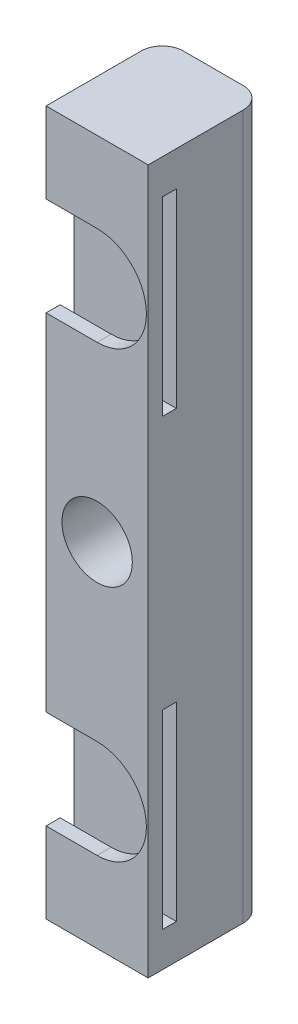
ISO-10303-21;
HEADER;
FILE_DESCRIPTION(('STEP AP214'),'2;1');
FILE_NAME('part.step','',(''),(''),'','','');
FILE_SCHEMA(('AUTOMOTIVE_DESIGN { 1 0 10303 214 1 1 1 1 }'));
ENDSEC;
DATA;
#1=APPLICATION_CONTEXT('core data for automotive mechanical design processes');
#2=APPLICATION_PROTOCOL_DEFINITION('international standard','automotive_design',2000,#1);
#3=PRODUCT_CONTEXT('',#1,'mechanical');
#4=PRODUCT('Part','Part','',(#3));
#5=PRODUCT_RELATED_PRODUCT_CATEGORY('part','',(#4));
#6=PRODUCT_DEFINITION_FORMATION('','',#4);
#7=PRODUCT_DEFINITION_CONTEXT('part definition',#1,'design');
#8=PRODUCT_DEFINITION('design','',#6,#7);
#9=PRODUCT_DEFINITION_SHAPE('','',#8);
#10=(LENGTH_UNIT() NAMED_UNIT(*) SI_UNIT(.MILLI.,.METRE.));
#11=(NAMED_UNIT(*) PLANE_ANGLE_UNIT() SI_UNIT($,.RADIAN.));
#12=(NAMED_UNIT(*) SI_UNIT($,.STERADIAN.) SOLID_ANGLE_UNIT());
#13=UNCERTAINTY_MEASURE_WITH_UNIT(LENGTH_MEASURE(1.E-05),#10,'distance_accuracy_value','');
#14=(GEOMETRIC_REPRESENTATION_CONTEXT(3) GLOBAL_UNCERTAINTY_ASSIGNED_CONTEXT((#13)) GLOBAL_UNIT_ASSIGNED_CONTEXT((#10,
#11,#12)) REPRESENTATION_CONTEXT('',''));
#15=CARTESIAN_POINT('',(0.,0.,0.));
#16=DIRECTION('',(0.,0.,1.));
#17=DIRECTION('',(1.,0.,0.));
#18=AXIS2_PLACEMENT_3D('',#15,#16,#17);
#19=CARTESIAN_POINT('',(4.25,-50.,3.));
#20=DIRECTION('',(0.,-1.,0.));
#21=DIRECTION('',(0.,0.,-1.));
#22=AXIS2_PLACEMENT_3D('',#19,#20,#21);
#23=CYLINDRICAL_SURFACE('',#22,3.);
#24=DIRECTION('',(0.,1.,0.));
#25=VECTOR('',#24,1.);
#26=CARTESIAN_POINT('',(7.25,-50.,3.));
#27=LINE('',#26,#25);
#28=CARTESIAN_POINT('',(7.25,-50.,3.));
#29=VERTEX_POINT('',#28);
#30=CARTESIAN_POINT('',(7.25,50.,3.));
#31=VERTEX_POINT('',#30);
#32=EDGE_CURVE('E344',#29,#31,#27,.T.);
#33=ORIENTED_EDGE('',*,*,#32,.F.);
#34=CARTESIAN_POINT('',(4.25,-50.,3.));
#35=DIRECTION('',(0.,1.,0.));
#36=DIRECTION('',(0.,0.,1.));
#37=AXIS2_PLACEMENT_3D('',#34,#35,#36);
#38=CIRCLE('',#37,3.);
#39=CARTESIAN_POINT('',(4.25,-50.,0.));
#40=VERTEX_POINT('',#39);
#41=EDGE_CURVE('E46',#40,#29,#38,.F.);
#42=ORIENTED_EDGE('',*,*,#41,.F.);
#43=DIRECTION('',(0.,1.,0.));
#44=VECTOR('',#43,1.);
#45=CARTESIAN_POINT('',(4.25,-50.,0.));
#46=LINE('',#45,#44);
#47=CARTESIAN_POINT('',(4.25,50.,0.));
#48=VERTEX_POINT('',#47);
#49=EDGE_CURVE('E343',#48,#40,#46,.F.);
#50=ORIENTED_EDGE('',*,*,#49,.F.);
#51=CARTESIAN_POINT('',(4.25,50.,3.));
#52=DIRECTION('',(0.,-1.,0.));
#53=DIRECTION('',(0.,0.,-1.));
#54=AXIS2_PLACEMENT_3D('',#51,#52,#53);
#55=CIRCLE('',#54,3.);
#56=EDGE_CURVE('E11',#31,#48,#55,.F.);
#57=ORIENTED_EDGE('',*,*,#56,.F.);
#58=EDGE_LOOP('',(#33,#42,#50,#57));
#59=FACE_BOUND('',#58,.T.);
#60=ADVANCED_FACE('F39',(#59),#23,.T.);
#61=CARTESIAN_POINT('',(-4.25,-50.,3.));
#62=DIRECTION('',(0.,1.,0.));
#63=DIRECTION('',(0.,0.,1.));
#64=AXIS2_PLACEMENT_3D('',#61,#62,#63);
#65=CYLINDRICAL_SURFACE('',#64,3.);
#66=DIRECTION('',(0.,-1.,0.));
#67=VECTOR('',#66,1.);
#68=CARTESIAN_POINT('',(-7.25,-50.,3.));
#69=LINE('',#68,#67);
#70=CARTESIAN_POINT('',(-7.25,50.,3.));
#71=VERTEX_POINT('',#70);
#72=CARTESIAN_POINT('',(-7.25,-50.,3.));
#73=VERTEX_POINT('',#72);
#74=EDGE_CURVE('E334',#71,#73,#69,.T.);
#75=ORIENTED_EDGE('',*,*,#74,.F.);
#76=CARTESIAN_POINT('',(-4.25,50.,3.));
#77=DIRECTION('',(0.,-1.,0.));
#78=DIRECTION('',(0.,0.,-1.));
#79=AXIS2_PLACEMENT_3D('',#76,#77,#78);
#80=CIRCLE('',#79,3.);
#81=CARTESIAN_POINT('',(-4.25,50.,0.));
#82=VERTEX_POINT('',#81);
#83=EDGE_CURVE('E336',#82,#71,#80,.F.);
#84=ORIENTED_EDGE('',*,*,#83,.F.);
#85=DIRECTION('',(0.,-1.,0.));
#86=VECTOR('',#85,1.);
#87=CARTESIAN_POINT('',(-4.25,-50.,0.));
#88=LINE('',#87,#86);
#89=CARTESIAN_POINT('',(-4.25,-50.,0.));
#90=VERTEX_POINT('',#89);
#91=EDGE_CURVE('E333',#90,#82,#88,.F.);
#92=ORIENTED_EDGE('',*,*,#91,.F.);
#93=CARTESIAN_POINT('',(-4.25,-50.,3.));
#94=DIRECTION('',(0.,1.,0.));
#95=DIRECTION('',(0.,0.,1.));
#96=AXIS2_PLACEMENT_3D('',#93,#94,#95);
#97=CIRCLE('',#96,3.);
#98=EDGE_CURVE('E338',#73,#90,#97,.F.);
#99=ORIENTED_EDGE('',*,*,#98,.F.);
#100=EDGE_LOOP('',(#75,#84,#92,#99));
#101=FACE_BOUND('',#100,.T.);
#102=ADVANCED_FACE('F370',(#101),#65,.T.);
#103=CARTESIAN_POINT('',(0.,0.,16.5));
#104=DIRECTION('',(0.,0.,-1.));
#105=DIRECTION('',(-1.,0.,0.));
#106=AXIS2_PLACEMENT_3D('',#103,#104,#105);
#107=PLANE('',#106);
#108=CARTESIAN_POINT('',(0.,0.,16.5));
#109=DIRECTION('',(0.,0.,1.));
#110=DIRECTION('',(1.,0.,0.));
#111=AXIS2_PLACEMENT_3D('',#108,#109,#110);
#112=CIRCLE('',#111,5.);
#113=CARTESIAN_POINT('',(5.,0.,16.5));
#114=VERTEX_POINT('',#113);
#115=EDGE_CURVE('E276',#114,#114,#112,.T.);
#116=ORIENTED_EDGE('',*,*,#115,.F.);
#117=EDGE_LOOP('',(#116));
#118=FACE_BOUND('',#117,.T.);
#119=DIRECTION('',(0.,-1.,0.));
#120=VECTOR('',#119,1.);
#121=CARTESIAN_POINT('',(-7.25,-50.,16.5));
#122=LINE('',#121,#120);
#123=CARTESIAN_POINT('',(-7.25,50.,16.5));
#124=VERTEX_POINT('',#123);
#125=CARTESIAN_POINT('',(-7.25,38.55,16.5));
#126=VERTEX_POINT('',#125);
#127=EDGE_CURVE('E293',#124,#126,#122,.T.);
#128=ORIENTED_EDGE('',*,*,#127,.T.);
#129=DIRECTION('',(1.,0.,0.));
#130=VECTOR('',#129,1.);
#131=CARTESIAN_POINT('',(0.,38.55,16.5));
#132=LINE('',#131,#130);
#133=CARTESIAN_POINT('',(0.,38.55,16.5));
#134=VERTEX_POINT('',#133);
#135=EDGE_CURVE('E188',#126,#134,#132,.T.);
#136=ORIENTED_EDGE('',*,*,#135,.T.);
#137=CARTESIAN_POINT('',(0.,31.55,16.5));
#138=DIRECTION('',(0.,0.,-1.));
#139=DIRECTION('',(1.,0.,0.));
#140=AXIS2_PLACEMENT_3D('',#137,#138,#139);
#141=CIRCLE('',#140,7.);
#142=CARTESIAN_POINT('',(0.,24.55,16.5));
#143=VERTEX_POINT('',#142);
#144=EDGE_CURVE('E590',#134,#143,#141,.T.);
#145=ORIENTED_EDGE('',*,*,#144,.T.);
#146=DIRECTION('',(-1.,0.,0.));
#147=VECTOR('',#146,1.);
#148=CARTESIAN_POINT('',(0.,24.55,16.5));
#149=LINE('',#148,#147);
#150=CARTESIAN_POINT('',(-7.25,24.55,16.5));
#151=VERTEX_POINT('',#150);
#152=EDGE_CURVE('E584',#143,#151,#149,.T.);
#153=ORIENTED_EDGE('',*,*,#152,.T.);
#154=CARTESIAN_POINT('',(-7.25,-24.55,16.5));
#155=VERTEX_POINT('',#154);
#156=EDGE_CURVE('E295',#151,#155,#122,.T.);
#157=ORIENTED_EDGE('',*,*,#156,.T.);
#158=DIRECTION('',(-1.,0.,0.));
#159=VECTOR('',#158,1.);
#160=CARTESIAN_POINT('',(0.,-24.55,16.5));
#161=LINE('',#160,#159);
#162=CARTESIAN_POINT('',(0.,-24.55,16.5));
#163=VERTEX_POINT('',#162);
#164=EDGE_CURVE('E241',#163,#155,#161,.T.);
#165=ORIENTED_EDGE('',*,*,#164,.F.);
#166=CARTESIAN_POINT('',(0.,-31.55,16.5));
#167=DIRECTION('',(0.,0.,1.));
#168=DIRECTION('',(1.,0.,0.));
#169=AXIS2_PLACEMENT_3D('',#166,#167,#168);
#170=CIRCLE('',#169,7.);
#171=CARTESIAN_POINT('',(0.,-38.55,16.5));
#172=VERTEX_POINT('',#171);
#173=EDGE_CURVE('E227',#172,#163,#170,.T.);
#174=ORIENTED_EDGE('',*,*,#173,.F.);
#175=DIRECTION('',(1.,0.,0.));
#176=VECTOR('',#175,1.);
#177=CARTESIAN_POINT('',(0.,-38.55,16.5));
#178=LINE('',#177,#176);
#179=CARTESIAN_POINT('',(-7.25,-38.55,16.5));
#180=VERTEX_POINT('',#179);
#181=EDGE_CURVE('E235',#180,#172,#178,.T.);
#182=ORIENTED_EDGE('',*,*,#181,.F.);
#183=CARTESIAN_POINT('',(-7.25,-50.,16.5));
#184=VERTEX_POINT('',#183);
#185=EDGE_CURVE('E286',#180,#184,#122,.T.);
#186=ORIENTED_EDGE('',*,*,#185,.T.);
#187=DIRECTION('',(1.,0.,0.));
#188=VECTOR('',#187,1.);
#189=CARTESIAN_POINT('',(7.25,-50.,16.5));
#190=LINE('',#189,#188);
#191=CARTESIAN_POINT('',(7.25,-50.,16.5));
#192=VERTEX_POINT('',#191);
#193=EDGE_CURVE('E291',#184,#192,#190,.T.);
#194=ORIENTED_EDGE('',*,*,#193,.T.);
#195=DIRECTION('',(0.,1.,0.));
#196=VECTOR('',#195,1.);
#197=CARTESIAN_POINT('',(7.25,-50.,16.5));
#198=LINE('',#197,#196);
#199=CARTESIAN_POINT('',(7.25,50.,16.5));
#200=VERTEX_POINT('',#199);
#201=EDGE_CURVE('E298',#192,#200,#198,.T.);
#202=ORIENTED_EDGE('',*,*,#201,.T.);
#203=DIRECTION('',(-1.,0.,0.));
#204=VECTOR('',#203,1.);
#205=CARTESIAN_POINT('',(7.25,50.,16.5));
#206=LINE('',#205,#204);
#207=EDGE_CURVE('E287',#200,#124,#206,.T.);
#208=ORIENTED_EDGE('',*,*,#207,.T.);
#209=EDGE_LOOP('',(#128,#136,#145,#153,#157,#165,#174,#182,#186,#194,#202,#208));
#210=FACE_BOUND('',#209,.T.);
#211=ADVANCED_FACE('F357',(#118,#210),#107,.F.);
#212=CARTESIAN_POINT('',(0.,0.,14.5));
#213=DIRECTION('',(0.,0.,-1.));
#214=DIRECTION('',(-1.,0.,0.));
#215=AXIS2_PLACEMENT_3D('',#212,#213,#214);
#216=PLANE('',#215);
#217=DIRECTION('',(-1.,0.,0.));
#218=VECTOR('',#217,1.);
#219=CARTESIAN_POINT('',(0.,24.55,14.5));
#220=LINE('',#219,#218);
#221=CARTESIAN_POINT('',(0.,24.55,14.5));
#222=VERTEX_POINT('',#221);
#223=CARTESIAN_POINT('',(-7.25,24.55,14.5));
#224=VERTEX_POINT('',#223);
#225=EDGE_CURVE('E205',#222,#224,#220,.T.);
#226=ORIENTED_EDGE('',*,*,#225,.F.);
#227=CARTESIAN_POINT('',(0.,31.55,14.5));
#228=DIRECTION('',(0.,0.,-1.));
#229=DIRECTION('',(1.,0.,0.));
#230=AXIS2_PLACEMENT_3D('',#227,#228,#229);
#231=CIRCLE('',#230,7.);
#232=CARTESIAN_POINT('',(0.,38.55,14.5));
#233=VERTEX_POINT('',#232);
#234=EDGE_CURVE('E204',#233,#222,#231,.T.);
#235=ORIENTED_EDGE('',*,*,#234,.F.);
#236=DIRECTION('',(1.,0.,0.));
#237=VECTOR('',#236,1.);
#238=CARTESIAN_POINT('',(0.,38.55,14.5));
#239=LINE('',#238,#237);
#240=CARTESIAN_POINT('',(-7.25,38.55,14.5));
#241=VERTEX_POINT('',#240);
#242=EDGE_CURVE('E190',#241,#233,#239,.T.);
#243=ORIENTED_EDGE('',*,*,#242,.F.);
#244=DIRECTION('',(0.,1.,0.));
#245=VECTOR('',#244,1.);
#246=CARTESIAN_POINT('',(-7.25,-50.,14.5));
#247=LINE('',#246,#245);
#248=CARTESIAN_POINT('',(-7.25,45.05,14.5));
#249=VERTEX_POINT('',#248);
#250=EDGE_CURVE('E200',#241,#249,#247,.T.);
#251=ORIENTED_EDGE('',*,*,#250,.T.);
#252=DIRECTION('',(1.,0.,0.));
#253=VECTOR('',#252,1.);
#254=CARTESIAN_POINT('',(-13.5,45.05,14.5));
#255=LINE('',#254,#253);
#256=CARTESIAN_POINT('',(7.25,45.05,14.5));
#257=VERTEX_POINT('',#256);
#258=EDGE_CURVE('E592',#249,#257,#255,.T.);
#259=ORIENTED_EDGE('',*,*,#258,.T.);
#260=DIRECTION('',(0.,-1.,0.));
#261=VECTOR('',#260,1.);
#262=CARTESIAN_POINT('',(7.25,-50.,14.5));
#263=LINE('',#262,#261);
#264=CARTESIAN_POINT('',(7.25,18.05,14.5));
#265=VERTEX_POINT('',#264);
#266=EDGE_CURVE('E324',#257,#265,#263,.T.);
#267=ORIENTED_EDGE('',*,*,#266,.T.);
#268=DIRECTION('',(-1.,0.,0.));
#269=VECTOR('',#268,1.);
#270=CARTESIAN_POINT('',(-13.5,18.05,14.5));
#271=LINE('',#270,#269);
#272=CARTESIAN_POINT('',(-7.25,18.05,14.5));
#273=VERTEX_POINT('',#272);
#274=EDGE_CURVE('E220',#265,#273,#271,.T.);
#275=ORIENTED_EDGE('',*,*,#274,.T.);
#276=EDGE_CURVE('E208',#273,#224,#247,.T.);
#277=ORIENTED_EDGE('',*,*,#276,.T.);
#278=EDGE_LOOP('',(#226,#235,#243,#251,#259,#267,#275,#277));
#279=FACE_BOUND('',#278,.T.);
#280=ADVANCED_FACE('F198',(#279),#216,.T.);
#281=CARTESIAN_POINT('',(0.,0.,14.5));
#282=DIRECTION('',(0.,0.,-1.));
#283=DIRECTION('',(-1.,0.,0.));
#284=AXIS2_PLACEMENT_3D('',#281,#282,#283);
#285=PLANE('',#284);
#286=DIRECTION('',(0.,1.,0.));
#287=VECTOR('',#286,1.);
#288=CARTESIAN_POINT('',(-7.25,-50.,14.5));
#289=LINE('',#288,#287);
#290=CARTESIAN_POINT('',(-7.25,-45.05,14.5));
#291=VERTEX_POINT('',#290);
#292=CARTESIAN_POINT('',(-7.25,-38.55,14.5));
#293=VERTEX_POINT('',#292);
#294=EDGE_CURVE('E269',#291,#293,#289,.T.);
#295=ORIENTED_EDGE('',*,*,#294,.T.);
#296=DIRECTION('',(1.,0.,0.));
#297=VECTOR('',#296,1.);
#298=CARTESIAN_POINT('',(0.,-38.55,14.5));
#299=LINE('',#298,#297);
#300=CARTESIAN_POINT('',(0.,-38.55,14.5));
#301=VERTEX_POINT('',#300);
#302=EDGE_CURVE('E232',#293,#301,#299,.T.);
#303=ORIENTED_EDGE('',*,*,#302,.T.);
#304=CARTESIAN_POINT('',(0.,-31.55,14.5));
#305=DIRECTION('',(0.,0.,1.));
#306=DIRECTION('',(1.,0.,0.));
#307=AXIS2_PLACEMENT_3D('',#304,#305,#306);
#308=CIRCLE('',#307,7.);
#309=CARTESIAN_POINT('',(0.,-24.55,14.5));
#310=VERTEX_POINT('',#309);
#311=EDGE_CURVE('E226',#301,#310,#308,.T.);
#312=ORIENTED_EDGE('',*,*,#311,.T.);
#313=DIRECTION('',(-1.,0.,0.));
#314=VECTOR('',#313,1.);
#315=CARTESIAN_POINT('',(0.,-24.55,14.5));
#316=LINE('',#315,#314);
#317=CARTESIAN_POINT('',(-7.25,-24.55,14.5));
#318=VERTEX_POINT('',#317);
#319=EDGE_CURVE('E233',#310,#318,#316,.T.);
#320=ORIENTED_EDGE('',*,*,#319,.T.);
#321=CARTESIAN_POINT('',(-7.25,-18.05,14.5));
#322=VERTEX_POINT('',#321);
#323=EDGE_CURVE('E262',#318,#322,#289,.T.);
#324=ORIENTED_EDGE('',*,*,#323,.T.);
#325=DIRECTION('',(-1.,0.,0.));
#326=VECTOR('',#325,1.);
#327=CARTESIAN_POINT('',(-13.5,-18.05,14.5));
#328=LINE('',#327,#326);
#329=CARTESIAN_POINT('',(7.25,-18.05,14.5));
#330=VERTEX_POINT('',#329);
#331=EDGE_CURVE('E247',#330,#322,#328,.T.);
#332=ORIENTED_EDGE('',*,*,#331,.F.);
#333=DIRECTION('',(0.,-1.,0.));
#334=VECTOR('',#333,1.);
#335=CARTESIAN_POINT('',(7.25,-50.,14.5));
#336=LINE('',#335,#334);
#337=CARTESIAN_POINT('',(7.25,-45.05,14.5));
#338=VERTEX_POINT('',#337);
#339=EDGE_CURVE('E311',#330,#338,#336,.T.);
#340=ORIENTED_EDGE('',*,*,#339,.T.);
#341=DIRECTION('',(1.,0.,0.));
#342=VECTOR('',#341,1.);
#343=CARTESIAN_POINT('',(-13.5,-45.05,14.5));
#344=LINE('',#343,#342);
#345=EDGE_CURVE('E256',#291,#338,#344,.T.);
#346=ORIENTED_EDGE('',*,*,#345,.F.);
#347=EDGE_LOOP('',(#295,#303,#312,#320,#324,#332,#340,#346));
#348=FACE_BOUND('',#347,.T.);
#349=ADVANCED_FACE('F373',(#348),#285,.T.);
#350=CARTESIAN_POINT('',(7.25,50.,16.5));
#351=DIRECTION('',(0.,-1.,0.));
#352=DIRECTION('',(0.,0.,-1.));
#353=AXIS2_PLACEMENT_3D('',#350,#351,#352);
#354=PLANE('',#353);
#355=DIRECTION('',(0.,0.,-1.));
#356=VECTOR('',#355,1.);
#357=CARTESIAN_POINT('',(7.25,50.,16.5));
#358=LINE('',#357,#356);
#359=EDGE_CURVE('E296',#200,#31,#358,.T.);
#360=ORIENTED_EDGE('',*,*,#359,.T.);
#361=ORIENTED_EDGE('',*,*,#56,.T.);
#362=DIRECTION('',(-1.,0.,0.));
#363=VECTOR('',#362,1.);
#364=CARTESIAN_POINT('',(7.25,50.,0.));
#365=LINE('',#364,#363);
#366=EDGE_CURVE('E284',#48,#82,#365,.T.);
#367=ORIENTED_EDGE('',*,*,#366,.T.);
#368=ORIENTED_EDGE('',*,*,#83,.T.);
#369=DIRECTION('',(0.,0.,-1.));
#370=VECTOR('',#369,1.);
#371=CARTESIAN_POINT('',(-7.25,50.,16.5));
#372=LINE('',#371,#370);
#373=EDGE_CURVE('E307',#124,#71,#372,.T.);
#374=ORIENTED_EDGE('',*,*,#373,.F.);
#375=ORIENTED_EDGE('',*,*,#207,.F.);
#376=EDGE_LOOP('',(#360,#361,#367,#368,#374,#375));
#377=FACE_BOUND('',#376,.T.);
#378=ADVANCED_FACE('F371',(#377),#354,.F.);
#379=CARTESIAN_POINT('',(-7.25,-50.,16.5));
#380=DIRECTION('',(1.,0.,0.));
#381=DIRECTION('',(0.,0.,-1.));
#382=AXIS2_PLACEMENT_3D('',#379,#380,#381);
#383=PLANE('',#382);
#384=ORIENTED_EDGE('',*,*,#373,.T.);
#385=ORIENTED_EDGE('',*,*,#74,.T.);
#386=DIRECTION('',(0.,0.,-1.));
#387=VECTOR('',#386,1.);
#388=CARTESIAN_POINT('',(-7.25,-50.,16.5));
#389=LINE('',#388,#387);
#390=EDGE_CURVE('E306',#184,#73,#389,.T.);
#391=ORIENTED_EDGE('',*,*,#390,.F.);
#392=ORIENTED_EDGE('',*,*,#185,.F.);
#393=DIRECTION('',(0.,0.,1.));
#394=VECTOR('',#393,1.);
#395=CARTESIAN_POINT('',(-7.25,-38.55,14.5));
#396=LINE('',#395,#394);
#397=EDGE_CURVE('E248',#293,#180,#396,.T.);
#398=ORIENTED_EDGE('',*,*,#397,.F.);
#399=ORIENTED_EDGE('',*,*,#294,.F.);
#400=DIRECTION('',(0.,0.,-1.));
#401=VECTOR('',#400,1.);
#402=CARTESIAN_POINT('',(-7.25,-45.05,16.5));
#403=LINE('',#402,#401);
#404=CARTESIAN_POINT('',(-7.25,-45.05,12.5));
#405=VERTEX_POINT('',#404);
#406=EDGE_CURVE('E277',#291,#405,#403,.T.);
#407=ORIENTED_EDGE('',*,*,#406,.T.);
#408=DIRECTION('',(0.,1.,0.));
#409=VECTOR('',#408,1.);
#410=CARTESIAN_POINT('',(-7.25,-50.,12.5));
#411=LINE('',#410,#409);
#412=CARTESIAN_POINT('',(-7.25,-18.05,12.5));
#413=VERTEX_POINT('',#412);
#414=EDGE_CURVE('E268',#405,#413,#411,.T.);
#415=ORIENTED_EDGE('',*,*,#414,.T.);
#416=DIRECTION('',(0.,0.,1.));
#417=VECTOR('',#416,1.);
#418=CARTESIAN_POINT('',(-7.25,-18.05,16.5));
#419=LINE('',#418,#417);
#420=EDGE_CURVE('E271',#413,#322,#419,.T.);
#421=ORIENTED_EDGE('',*,*,#420,.T.);
#422=ORIENTED_EDGE('',*,*,#323,.F.);
#423=DIRECTION('',(0.,0.,1.));
#424=VECTOR('',#423,1.);
#425=CARTESIAN_POINT('',(-7.25,-24.55,14.5));
#426=LINE('',#425,#424);
#427=EDGE_CURVE('E252',#318,#155,#426,.T.);
#428=ORIENTED_EDGE('',*,*,#427,.T.);
#429=ORIENTED_EDGE('',*,*,#156,.F.);
#430=DIRECTION('',(0.,0.,1.));
#431=VECTOR('',#430,1.);
#432=CARTESIAN_POINT('',(-7.25,24.55,14.5));
#433=LINE('',#432,#431);
#434=EDGE_CURVE('E191',#224,#151,#433,.T.);
#435=ORIENTED_EDGE('',*,*,#434,.F.);
#436=ORIENTED_EDGE('',*,*,#276,.F.);
#437=DIRECTION('',(0.,0.,1.));
#438=VECTOR('',#437,1.);
#439=CARTESIAN_POINT('',(-7.25,18.05,16.5));
#440=LINE('',#439,#438);
#441=CARTESIAN_POINT('',(-7.25,18.05,12.5));
#442=VERTEX_POINT('',#441);
#443=EDGE_CURVE('E221',#442,#273,#440,.T.);
#444=ORIENTED_EDGE('',*,*,#443,.F.);
#445=DIRECTION('',(0.,1.,0.));
#446=VECTOR('',#445,1.);
#447=CARTESIAN_POINT('',(-7.25,-50.,12.5));
#448=LINE('',#447,#446);
#449=CARTESIAN_POINT('',(-7.25,45.05,12.5));
#450=VERTEX_POINT('',#449);
#451=EDGE_CURVE('E211',#442,#450,#448,.T.);
#452=ORIENTED_EDGE('',*,*,#451,.T.);
#453=DIRECTION('',(0.,0.,-1.));
#454=VECTOR('',#453,1.);
#455=CARTESIAN_POINT('',(-7.25,45.05,16.5));
#456=LINE('',#455,#454);
#457=EDGE_CURVE('E209',#249,#450,#456,.T.);
#458=ORIENTED_EDGE('',*,*,#457,.F.);
#459=ORIENTED_EDGE('',*,*,#250,.F.);
#460=DIRECTION('',(0.,0.,1.));
#461=VECTOR('',#460,1.);
#462=CARTESIAN_POINT('',(-7.25,38.55,14.5));
#463=LINE('',#462,#461);
#464=EDGE_CURVE('E183',#241,#126,#463,.T.);
#465=ORIENTED_EDGE('',*,*,#464,.T.);
#466=ORIENTED_EDGE('',*,*,#127,.F.);
#467=EDGE_LOOP('',(#384,#385,#391,#392,#398,#399,#407,#415,#421,#422,#428,#429,#435,#436,#444,
#452,#458,#459,#465,#466));
#468=FACE_BOUND('',#467,.T.);
#469=ADVANCED_FACE('F210',(#468),#383,.F.);
#470=CARTESIAN_POINT('',(7.25,-50.,16.5));
#471=DIRECTION('',(0.,1.,0.));
#472=DIRECTION('',(0.,0.,1.));
#473=AXIS2_PLACEMENT_3D('',#470,#471,#472);
#474=PLANE('',#473);
#475=DIRECTION('',(1.,0.,0.));
#476=VECTOR('',#475,1.);
#477=CARTESIAN_POINT('',(7.25,-50.,0.));
#478=LINE('',#477,#476);
#479=EDGE_CURVE('E288',#90,#40,#478,.T.);
#480=ORIENTED_EDGE('',*,*,#479,.T.);
#481=ORIENTED_EDGE('',*,*,#41,.T.);
#482=DIRECTION('',(0.,0.,-1.));
#483=VECTOR('',#482,1.);
#484=CARTESIAN_POINT('',(7.25,-50.,16.5));
#485=LINE('',#484,#483);
#486=EDGE_CURVE('E303',#192,#29,#485,.T.);
#487=ORIENTED_EDGE('',*,*,#486,.F.);
#488=ORIENTED_EDGE('',*,*,#193,.F.);
#489=ORIENTED_EDGE('',*,*,#390,.T.);
#490=ORIENTED_EDGE('',*,*,#98,.T.);
#491=EDGE_LOOP('',(#480,#481,#487,#488,#489,#490));
#492=FACE_BOUND('',#491,.T.);
#493=ADVANCED_FACE('F349',(#492),#474,.F.);
#494=CARTESIAN_POINT('',(7.25,-50.,16.5));
#495=DIRECTION('',(-1.,0.,0.));
#496=DIRECTION('',(0.,0.,1.));
#497=AXIS2_PLACEMENT_3D('',#494,#495,#496);
#498=PLANE('',#497);
#499=DIRECTION('',(0.,0.,1.));
#500=VECTOR('',#499,1.);
#501=CARTESIAN_POINT('',(7.25,45.05,16.5));
#502=LINE('',#501,#500);
#503=CARTESIAN_POINT('',(7.25,45.05,12.5));
#504=VERTEX_POINT('',#503);
#505=EDGE_CURVE('E321',#504,#257,#502,.T.);
#506=ORIENTED_EDGE('',*,*,#505,.F.);
#507=DIRECTION('',(0.,-1.,0.));
#508=VECTOR('',#507,1.);
#509=CARTESIAN_POINT('',(7.25,-50.,12.5));
#510=LINE('',#509,#508);
#511=CARTESIAN_POINT('',(7.25,18.05,12.5));
#512=VERTEX_POINT('',#511);
#513=EDGE_CURVE('E328',#504,#512,#510,.T.);
#514=ORIENTED_EDGE('',*,*,#513,.T.);
#515=DIRECTION('',(0.,0.,-1.));
#516=VECTOR('',#515,1.);
#517=CARTESIAN_POINT('',(7.25,18.05,16.5));
#518=LINE('',#517,#516);
#519=EDGE_CURVE('E327',#265,#512,#518,.T.);
#520=ORIENTED_EDGE('',*,*,#519,.F.);
#521=ORIENTED_EDGE('',*,*,#266,.F.);
#522=EDGE_LOOP('',(#506,#514,#520,#521));
#523=FACE_BOUND('',#522,.T.);
#524=DIRECTION('',(0.,0.,-1.));
#525=VECTOR('',#524,1.);
#526=CARTESIAN_POINT('',(7.25,-18.05,16.5));
#527=LINE('',#526,#525);
#528=CARTESIAN_POINT('',(7.25,-18.05,12.5));
#529=VERTEX_POINT('',#528);
#530=EDGE_CURVE('E312',#330,#529,#527,.T.);
#531=ORIENTED_EDGE('',*,*,#530,.T.);
#532=DIRECTION('',(0.,-1.,0.));
#533=VECTOR('',#532,1.);
#534=CARTESIAN_POINT('',(7.25,-50.,12.5));
#535=LINE('',#534,#533);
#536=CARTESIAN_POINT('',(7.25,-45.05,12.5));
#537=VERTEX_POINT('',#536);
#538=EDGE_CURVE('E316',#529,#537,#535,.T.);
#539=ORIENTED_EDGE('',*,*,#538,.T.);
#540=DIRECTION('',(0.,0.,1.));
#541=VECTOR('',#540,1.);
#542=CARTESIAN_POINT('',(7.25,-45.05,16.5));
#543=LINE('',#542,#541);
#544=EDGE_CURVE('E317',#537,#338,#543,.T.);
#545=ORIENTED_EDGE('',*,*,#544,.T.);
#546=ORIENTED_EDGE('',*,*,#339,.F.);
#547=EDGE_LOOP('',(#531,#539,#545,#546));
#548=FACE_BOUND('',#547,.T.);
#549=ORIENTED_EDGE('',*,*,#486,.T.);
#550=ORIENTED_EDGE('',*,*,#32,.T.);
#551=ORIENTED_EDGE('',*,*,#359,.F.);
#552=ORIENTED_EDGE('',*,*,#201,.F.);
#553=EDGE_LOOP('',(#549,#550,#551,#552));
#554=FACE_BOUND('',#553,.T.);
#555=ADVANCED_FACE('F351',(#523,#548,#554),#498,.F.);
#556=CARTESIAN_POINT('',(0.,0.,0.));
#557=DIRECTION('',(0.,0.,-1.));
#558=DIRECTION('',(-1.,0.,0.));
#559=AXIS2_PLACEMENT_3D('',#556,#557,#558);
#560=PLANE('',#559);
#561=ORIENTED_EDGE('',*,*,#366,.F.);
#562=ORIENTED_EDGE('',*,*,#49,.T.);
#563=ORIENTED_EDGE('',*,*,#479,.F.);
#564=ORIENTED_EDGE('',*,*,#91,.T.);
#565=EDGE_LOOP('',(#561,#562,#563,#564));
#566=FACE_BOUND('',#565,.T.);
#567=ADVANCED_FACE('F369',(#566),#560,.T.);
#568=CARTESIAN_POINT('',(0.,0.,3.5));
#569=DIRECTION('',(0.,0.,1.));
#570=DIRECTION('',(1.,0.,0.));
#571=AXIS2_PLACEMENT_3D('',#568,#569,#570);
#572=CYLINDRICAL_SURFACE('',#571,5.);
#573=CARTESIAN_POINT('',(0.,0.,3.5));
#574=DIRECTION('',(0.,0.,1.));
#575=DIRECTION('',(1.,0.,0.));
#576=AXIS2_PLACEMENT_3D('',#573,#574,#575);
#577=CIRCLE('',#576,5.);
#578=CARTESIAN_POINT('',(5.,0.,3.5));
#579=VERTEX_POINT('',#578);
#580=EDGE_CURVE('E278',#579,#579,#577,.T.);
#581=CARTESIAN_POINT('',(5.,0.,3.5));
#582=CARTESIAN_POINT('',(5.,0.,3.63541666666667));
#583=CARTESIAN_POINT('',(5.,0.,3.77083333333333));
#584=CARTESIAN_POINT('',(5.,0.,4.04166666666667));
#585=CARTESIAN_POINT('',(5.,0.,4.17708333333333));
#586=CARTESIAN_POINT('',(5.,0.,4.44791666666667));
#587=CARTESIAN_POINT('',(5.,0.,4.58333333333333));
#588=CARTESIAN_POINT('',(5.,0.,4.85416666666667));
#589=CARTESIAN_POINT('',(5.,0.,4.98958333333333));
#590=CARTESIAN_POINT('',(5.,0.,5.26041666666667));
#591=CARTESIAN_POINT('',(5.,0.,5.39583333333333));
#592=CARTESIAN_POINT('',(5.,0.,5.66666666666667));
#593=CARTESIAN_POINT('',(5.,0.,5.80208333333333));
#594=CARTESIAN_POINT('',(5.,0.,6.07291666666667));
#595=CARTESIAN_POINT('',(5.,0.,6.20833333333333));
#596=CARTESIAN_POINT('',(5.,0.,6.47916666666667));
#597=CARTESIAN_POINT('',(5.,0.,6.61458333333333));
#598=CARTESIAN_POINT('',(5.,0.,6.88541666666667));
#599=CARTESIAN_POINT('',(5.,0.,7.02083333333333));
#600=CARTESIAN_POINT('',(5.,0.,7.29166666666667));
#601=CARTESIAN_POINT('',(5.,0.,7.42708333333333));
#602=CARTESIAN_POINT('',(5.,0.,7.69791666666667));
#603=CARTESIAN_POINT('',(5.,0.,7.83333333333333));
#604=CARTESIAN_POINT('',(5.,0.,8.10416666666667));
#605=CARTESIAN_POINT('',(5.,0.,8.23958333333333));
#606=CARTESIAN_POINT('',(5.,0.,8.51041666666667));
#607=CARTESIAN_POINT('',(5.,0.,8.64583333333333));
#608=CARTESIAN_POINT('',(5.,0.,8.91666666666667));
#609=CARTESIAN_POINT('',(5.,0.,9.05208333333333));
#610=CARTESIAN_POINT('',(5.,0.,9.32291666666666));
#611=CARTESIAN_POINT('',(5.,0.,9.45833333333333));
#612=CARTESIAN_POINT('',(5.,0.,9.72916666666667));
#613=CARTESIAN_POINT('',(5.,0.,9.86458333333333));
#614=CARTESIAN_POINT('',(5.,0.,10.1354166666667));
#615=CARTESIAN_POINT('',(5.,0.,10.2708333333333));
#616=CARTESIAN_POINT('',(5.,0.,10.5416666666667));
#617=CARTESIAN_POINT('',(5.,0.,10.6770833333333));
#618=CARTESIAN_POINT('',(5.,0.,10.9479166666667));
#619=CARTESIAN_POINT('',(5.,0.,11.0833333333333));
#620=CARTESIAN_POINT('',(5.,0.,11.3541666666667));
#621=CARTESIAN_POINT('',(5.,0.,11.4895833333333));
#622=CARTESIAN_POINT('',(5.,0.,11.7604166666667));
#623=CARTESIAN_POINT('',(5.,0.,11.8958333333333));
#624=CARTESIAN_POINT('',(5.,0.,12.1666666666667));
#625=CARTESIAN_POINT('',(5.,0.,12.3020833333333));
#626=CARTESIAN_POINT('',(5.,0.,12.5729166666667));
#627=CARTESIAN_POINT('',(5.,0.,12.7083333333333));
#628=CARTESIAN_POINT('',(5.,0.,12.9791666666667));
#629=CARTESIAN_POINT('',(5.,0.,13.1145833333333));
#630=CARTESIAN_POINT('',(5.,0.,13.3854166666667));
#631=CARTESIAN_POINT('',(5.,0.,13.5208333333333));
#632=CARTESIAN_POINT('',(5.,0.,13.7916666666667));
#633=CARTESIAN_POINT('',(5.,0.,13.9270833333333));
#634=CARTESIAN_POINT('',(5.,0.,14.1979166666667));
#635=CARTESIAN_POINT('',(5.,0.,14.3333333333333));
#636=CARTESIAN_POINT('',(5.,0.,14.6041666666667));
#637=CARTESIAN_POINT('',(5.,0.,14.7395833333333));
#638=CARTESIAN_POINT('',(5.,0.,15.0104166666667));
#639=CARTESIAN_POINT('',(5.,0.,15.1458333333333));
#640=CARTESIAN_POINT('',(5.,0.,15.4166666666667));
#641=CARTESIAN_POINT('',(5.,0.,15.5520833333333));
#642=CARTESIAN_POINT('',(5.,0.,15.8229166666667));
#643=CARTESIAN_POINT('',(5.,0.,15.9583333333333));
#644=CARTESIAN_POINT('',(5.,0.,16.2291666666667));
#645=CARTESIAN_POINT('',(5.,0.,16.3645833333333));
#646=CARTESIAN_POINT('',(5.,0.,16.5));
#647=B_SPLINE_CURVE_WITH_KNOTS('',3,(#581,#582,#583,#584,#585,#586,#587,#588,#589,#590,#591,
#592,#593,#594,#595,#596,#597,#598,#599,#600,#601,#602,#603,#604,#605,#606,#607,#608,#609,#610,
#611,#612,#613,#614,#615,#616,#617,#618,#619,#620,#621,#622,#623,#624,#625,#626,#627,#628,#629,
#630,#631,#632,#633,#634,#635,#636,#637,#638,#639,#640,#641,#642,#643,#644,#645,#646),
.UNSPECIFIED.,.F.,.F.,(4,2,2,2,2,2,2,2,2,2,2,2,2,2,2,2,2,2,2,2,2,2,2,2,2,2,2,2,2,2,2,2,4),(0.,
0.40625,0.8125,1.21875,1.625,2.03125,2.4375,2.84375,3.25,3.65625,4.0625,4.46875,4.875,5.28125,
5.6875,6.09375,6.5,6.90625,7.3125,7.71875,8.125,8.53125,8.9375,9.34375,9.75,10.15625,10.5625,
10.96875,11.375,11.78125,12.1875,12.59375,13.),.UNSPECIFIED.);
#648=EDGE_CURVE('BSEAM402',#579,#114,#647,.T.);
#649=ORIENTED_EDGE('',*,*,#580,.F.);
#650=ORIENTED_EDGE('',*,*,#115,.T.);
#651=ORIENTED_EDGE('',*,*,#648,.T.);
#652=ORIENTED_EDGE('',*,*,#648,.F.);
#653=EDGE_LOOP('',(#649,#651,#650,#652));
#654=FACE_BOUND('',#653,.T.);
#655=ADVANCED_FACE('F402',(#654),#572,.F.);
#656=CARTESIAN_POINT('',(0.,0.,3.5));
#657=DIRECTION('',(0.,0.,1.));
#658=DIRECTION('',(1.,0.,0.));
#659=AXIS2_PLACEMENT_3D('',#656,#657,#658);
#660=PLANE('',#659);
#661=ORIENTED_EDGE('',*,*,#580,.T.);
#662=EDGE_LOOP('',(#661));
#663=FACE_BOUND('',#662,.T.);
#664=ADVANCED_FACE('F431',(#663),#660,.T.);
#665=CARTESIAN_POINT('',(-13.5,-45.05,12.5));
#666=DIRECTION('',(0.,-1.,0.));
#667=DIRECTION('',(0.,0.,-1.));
#668=AXIS2_PLACEMENT_3D('',#665,#666,#667);
#669=PLANE('',#668);
#670=ORIENTED_EDGE('',*,*,#345,.T.);
#671=ORIENTED_EDGE('',*,*,#544,.F.);
#672=DIRECTION('',(1.,0.,0.));
#673=VECTOR('',#672,1.);
#674=CARTESIAN_POINT('',(-13.5,-45.05,12.5));
#675=LINE('',#674,#673);
#676=EDGE_CURVE('E260',#405,#537,#675,.T.);
#677=ORIENTED_EDGE('',*,*,#676,.F.);
#678=ORIENTED_EDGE('',*,*,#406,.F.);
#679=EDGE_LOOP('',(#670,#671,#677,#678));
#680=FACE_BOUND('',#679,.T.);
#681=ADVANCED_FACE('F439',(#680),#669,.F.);
#682=CARTESIAN_POINT('',(-13.5,-18.05,12.5));
#683=DIRECTION('',(0.,1.,0.));
#684=DIRECTION('',(0.,0.,1.));
#685=AXIS2_PLACEMENT_3D('',#682,#683,#684);
#686=PLANE('',#685);
#687=DIRECTION('',(-1.,0.,0.));
#688=VECTOR('',#687,1.);
#689=CARTESIAN_POINT('',(-13.5,-18.05,12.5));
#690=LINE('',#689,#688);
#691=EDGE_CURVE('E253',#529,#413,#690,.T.);
#692=ORIENTED_EDGE('',*,*,#691,.F.);
#693=ORIENTED_EDGE('',*,*,#530,.F.);
#694=ORIENTED_EDGE('',*,*,#331,.T.);
#695=ORIENTED_EDGE('',*,*,#420,.F.);
#696=EDGE_LOOP('',(#692,#693,#694,#695));
#697=FACE_BOUND('',#696,.T.);
#698=ADVANCED_FACE('F446',(#697),#686,.F.);
#699=CARTESIAN_POINT('',(0.,0.,12.5));
#700=DIRECTION('',(0.,0.,-1.));
#701=DIRECTION('',(-1.,0.,0.));
#702=AXIS2_PLACEMENT_3D('',#699,#700,#701);
#703=PLANE('',#702);
#704=ORIENTED_EDGE('',*,*,#676,.T.);
#705=ORIENTED_EDGE('',*,*,#538,.F.);
#706=ORIENTED_EDGE('',*,*,#691,.T.);
#707=ORIENTED_EDGE('',*,*,#414,.F.);
#708=EDGE_LOOP('',(#704,#705,#706,#707));
#709=FACE_BOUND('',#708,.T.);
#710=ADVANCED_FACE('F458',(#709),#703,.F.);
#711=CARTESIAN_POINT('',(0.,-31.55,14.5));
#712=DIRECTION('',(0.,0.,1.));
#713=DIRECTION('',(1.,0.,0.));
#714=AXIS2_PLACEMENT_3D('',#711,#712,#713);
#715=CYLINDRICAL_SURFACE('',#714,7.);
#716=ORIENTED_EDGE('',*,*,#173,.T.);
#717=DIRECTION('',(0.,0.,1.));
#718=VECTOR('',#717,1.);
#719=CARTESIAN_POINT('',(0.,-24.55,14.5));
#720=LINE('',#719,#718);
#721=EDGE_CURVE('E238',#310,#163,#720,.T.);
#722=ORIENTED_EDGE('',*,*,#721,.F.);
#723=ORIENTED_EDGE('',*,*,#311,.F.);
#724=DIRECTION('',(0.,0.,1.));
#725=VECTOR('',#724,1.);
#726=CARTESIAN_POINT('',(0.,-38.55,14.5));
#727=LINE('',#726,#725);
#728=EDGE_CURVE('E246',#301,#172,#727,.T.);
#729=ORIENTED_EDGE('',*,*,#728,.T.);
#730=EDGE_LOOP('',(#716,#722,#723,#729));
#731=FACE_BOUND('',#730,.T.);
#732=ADVANCED_FACE('F469',(#731),#715,.F.);
#733=CARTESIAN_POINT('',(0.,-38.55,14.5));
#734=DIRECTION('',(0.,-1.,0.));
#735=DIRECTION('',(0.,0.,-1.));
#736=AXIS2_PLACEMENT_3D('',#733,#734,#735);
#737=PLANE('',#736);
#738=ORIENTED_EDGE('',*,*,#181,.T.);
#739=ORIENTED_EDGE('',*,*,#728,.F.);
#740=ORIENTED_EDGE('',*,*,#302,.F.);
#741=ORIENTED_EDGE('',*,*,#397,.T.);
#742=EDGE_LOOP('',(#738,#739,#740,#741));
#743=FACE_BOUND('',#742,.T.);
#744=ADVANCED_FACE('F481',(#743),#737,.F.);
#745=CARTESIAN_POINT('',(0.,-24.55,14.5));
#746=DIRECTION('',(0.,1.,0.));
#747=DIRECTION('',(0.,0.,1.));
#748=AXIS2_PLACEMENT_3D('',#745,#746,#747);
#749=PLANE('',#748);
#750=ORIENTED_EDGE('',*,*,#164,.T.);
#751=ORIENTED_EDGE('',*,*,#427,.F.);
#752=ORIENTED_EDGE('',*,*,#319,.F.);
#753=ORIENTED_EDGE('',*,*,#721,.T.);
#754=EDGE_LOOP('',(#750,#751,#752,#753));
#755=FACE_BOUND('',#754,.T.);
#756=ADVANCED_FACE('F494',(#755),#749,.F.);
#757=CARTESIAN_POINT('',(-13.5,18.05,12.5));
#758=DIRECTION('',(0.,1.,0.));
#759=DIRECTION('',(0.,0.,1.));
#760=AXIS2_PLACEMENT_3D('',#757,#758,#759);
#761=PLANE('',#760);
#762=ORIENTED_EDGE('',*,*,#443,.T.);
#763=ORIENTED_EDGE('',*,*,#274,.F.);
#764=ORIENTED_EDGE('',*,*,#519,.T.);
#765=DIRECTION('',(-1.,0.,0.));
#766=VECTOR('',#765,1.);
#767=CARTESIAN_POINT('',(-13.5,18.05,12.5));
#768=LINE('',#767,#766);
#769=EDGE_CURVE('E212',#512,#442,#768,.T.);
#770=ORIENTED_EDGE('',*,*,#769,.T.);
#771=EDGE_LOOP('',(#762,#763,#764,#770));
#772=FACE_BOUND('',#771,.T.);
#773=ADVANCED_FACE('F502',(#772),#761,.T.);
#774=CARTESIAN_POINT('',(-13.5,45.05,12.5));
#775=DIRECTION('',(0.,-1.,0.));
#776=DIRECTION('',(0.,0.,-1.));
#777=AXIS2_PLACEMENT_3D('',#774,#775,#776);
#778=PLANE('',#777);
#779=ORIENTED_EDGE('',*,*,#457,.T.);
#780=DIRECTION('',(1.,0.,0.));
#781=VECTOR('',#780,1.);
#782=CARTESIAN_POINT('',(-13.5,45.05,12.5));
#783=LINE('',#782,#781);
#784=EDGE_CURVE('E216',#450,#504,#783,.T.);
#785=ORIENTED_EDGE('',*,*,#784,.T.);
#786=ORIENTED_EDGE('',*,*,#505,.T.);
#787=ORIENTED_EDGE('',*,*,#258,.F.);
#788=EDGE_LOOP('',(#779,#785,#786,#787));
#789=FACE_BOUND('',#788,.T.);
#790=ADVANCED_FACE('F511',(#789),#778,.T.);
#791=CARTESIAN_POINT('',(0.,0.,12.5));
#792=DIRECTION('',(0.,0.,-1.));
#793=DIRECTION('',(-1.,0.,0.));
#794=AXIS2_PLACEMENT_3D('',#791,#792,#793);
#795=PLANE('',#794);
#796=ORIENTED_EDGE('',*,*,#769,.F.);
#797=ORIENTED_EDGE('',*,*,#513,.F.);
#798=ORIENTED_EDGE('',*,*,#784,.F.);
#799=ORIENTED_EDGE('',*,*,#451,.F.);
#800=EDGE_LOOP('',(#796,#797,#798,#799));
#801=FACE_BOUND('',#800,.T.);
#802=ADVANCED_FACE('F523',(#801),#795,.F.);
#803=CARTESIAN_POINT('',(0.,31.55,14.5));
#804=DIRECTION('',(0.,0.,1.));
#805=DIRECTION('',(1.,0.,0.));
#806=AXIS2_PLACEMENT_3D('',#803,#804,#805);
#807=CYLINDRICAL_SURFACE('',#806,7.);
#808=ORIENTED_EDGE('',*,*,#144,.F.);
#809=DIRECTION('',(0.,0.,1.));
#810=VECTOR('',#809,1.);
#811=CARTESIAN_POINT('',(0.,38.55,14.5));
#812=LINE('',#811,#810);
#813=EDGE_CURVE('E193',#233,#134,#812,.T.);
#814=ORIENTED_EDGE('',*,*,#813,.F.);
#815=ORIENTED_EDGE('',*,*,#234,.T.);
#816=DIRECTION('',(0.,0.,1.));
#817=VECTOR('',#816,1.);
#818=CARTESIAN_POINT('',(0.,24.55,14.5));
#819=LINE('',#818,#817);
#820=EDGE_CURVE('E581',#222,#143,#819,.T.);
#821=ORIENTED_EDGE('',*,*,#820,.T.);
#822=EDGE_LOOP('',(#808,#814,#815,#821));
#823=FACE_BOUND('',#822,.T.);
#824=ADVANCED_FACE('F531',(#823),#807,.F.);
#825=CARTESIAN_POINT('',(0.,24.55,14.5));
#826=DIRECTION('',(0.,1.,0.));
#827=DIRECTION('',(0.,0.,1.));
#828=AXIS2_PLACEMENT_3D('',#825,#826,#827);
#829=PLANE('',#828);
#830=ORIENTED_EDGE('',*,*,#152,.F.);
#831=ORIENTED_EDGE('',*,*,#820,.F.);
#832=ORIENTED_EDGE('',*,*,#225,.T.);
#833=ORIENTED_EDGE('',*,*,#434,.T.);
#834=EDGE_LOOP('',(#830,#831,#832,#833));
#835=FACE_BOUND('',#834,.T.);
#836=ADVANCED_FACE('F552',(#835),#829,.T.);
#837=CARTESIAN_POINT('',(0.,38.55,14.5));
#838=DIRECTION('',(0.,-1.,0.));
#839=DIRECTION('',(0.,0.,-1.));
#840=AXIS2_PLACEMENT_3D('',#837,#838,#839);
#841=PLANE('',#840);
#842=ORIENTED_EDGE('',*,*,#135,.F.);
#843=ORIENTED_EDGE('',*,*,#464,.F.);
#844=ORIENTED_EDGE('',*,*,#242,.T.);
#845=ORIENTED_EDGE('',*,*,#813,.T.);
#846=EDGE_LOOP('',(#842,#843,#844,#845));
#847=FACE_BOUND('',#846,.T.);
#848=ADVANCED_FACE('F187',(#847),#841,.T.);
#849=CLOSED_SHELL('',(#60,#102,#211,#280,#349,#378,#469,#493,#555,#567,#655,#664,#681,#698,#710,
#732,#744,#756,#773,#790,#802,#824,#836,#848));
#850=MANIFOLD_SOLID_BREP('B2',#849);
#851=ADVANCED_BREP_SHAPE_REPRESENTATION('',(#18,#850),#14);
#852=SHAPE_DEFINITION_REPRESENTATION(#9,#851);
ENDSEC;
END-ISO-10303-21;
